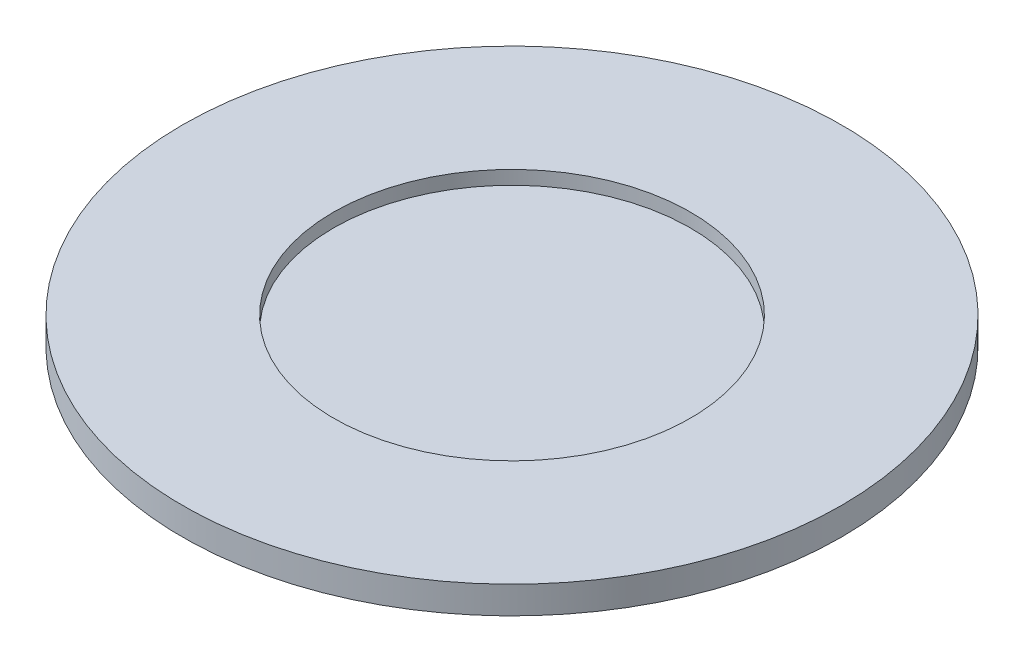
ISO-10303-21;
HEADER;
FILE_DESCRIPTION(('STEP AP214'),'2;1');
FILE_NAME('part.step','',(''),(''),'','','');
FILE_SCHEMA(('AUTOMOTIVE_DESIGN { 1 0 10303 214 1 1 1 1 }'));
ENDSEC;
DATA;
#1=APPLICATION_CONTEXT('core data for automotive mechanical design processes');
#2=APPLICATION_PROTOCOL_DEFINITION('international standard','automotive_design',2000,#1);
#3=PRODUCT_CONTEXT('',#1,'mechanical');
#4=PRODUCT('Part','Part','',(#3));
#5=PRODUCT_RELATED_PRODUCT_CATEGORY('part','',(#4));
#6=PRODUCT_DEFINITION_FORMATION('','',#4);
#7=PRODUCT_DEFINITION_CONTEXT('part definition',#1,'design');
#8=PRODUCT_DEFINITION('design','',#6,#7);
#9=PRODUCT_DEFINITION_SHAPE('','',#8);
#10=(LENGTH_UNIT() NAMED_UNIT(*) SI_UNIT(.MILLI.,.METRE.));
#11=(NAMED_UNIT(*) PLANE_ANGLE_UNIT() SI_UNIT($,.RADIAN.));
#12=(NAMED_UNIT(*) SI_UNIT($,.STERADIAN.) SOLID_ANGLE_UNIT());
#13=UNCERTAINTY_MEASURE_WITH_UNIT(LENGTH_MEASURE(1.E-05),#10,'distance_accuracy_value','');
#14=(GEOMETRIC_REPRESENTATION_CONTEXT(3) GLOBAL_UNCERTAINTY_ASSIGNED_CONTEXT((#13)) GLOBAL_UNIT_ASSIGNED_CONTEXT((#10,
#11,#12)) REPRESENTATION_CONTEXT('',''));
#15=CARTESIAN_POINT('',(0.,0.,0.));
#16=DIRECTION('',(0.,0.,1.));
#17=DIRECTION('',(1.,0.,0.));
#18=AXIS2_PLACEMENT_3D('',#15,#16,#17);
#19=CARTESIAN_POINT('',(-60.,97.7316257619381,0.));
#20=DIRECTION('',(0.,1.,0.));
#21=DIRECTION('',(-1.,0.,0.));
#22=AXIS2_PLACEMENT_3D('',#19,#20,#21);
#23=CYLINDRICAL_SURFACE('',#22,120.);
#24=CARTESIAN_POINT('',(-60.,76.3410550458716,0.));
#25=DIRECTION('',(0.,1.,0.));
#26=DIRECTION('',(-1.,0.,0.));
#27=AXIS2_PLACEMENT_3D('',#24,#25,#26);
#28=CIRCLE('',#27,120.);
#29=CARTESIAN_POINT('',(-180.,76.3410550458716,0.));
#30=VERTEX_POINT('',#29);
#31=EDGE_CURVE('E10',#30,#30,#28,.T.);
#32=ORIENTED_EDGE('',*,*,#31,.F.);
#33=EDGE_LOOP('',(#32));
#34=FACE_BOUND('',#33,.T.);
#35=CARTESIAN_POINT('',(-60.,66.3410550458716,0.));
#36=DIRECTION('',(0.,1.,0.));
#37=DIRECTION('',(-1.,0.,0.));
#38=AXIS2_PLACEMENT_3D('',#35,#36,#37);
#39=CIRCLE('',#38,120.);
#40=CARTESIAN_POINT('',(-180.,66.3410550458716,0.));
#41=VERTEX_POINT('',#40);
#42=EDGE_CURVE('E64',#41,#41,#39,.T.);
#43=ORIENTED_EDGE('',*,*,#42,.T.);
#44=EDGE_LOOP('',(#43));
#45=FACE_BOUND('',#44,.T.);
#46=ADVANCED_FACE('F39',(#34,#45),#23,.T.);
#47=CARTESIAN_POINT('',(5.00000000000001,76.3410550458716,0.));
#48=DIRECTION('',(0.,-1.,0.));
#49=DIRECTION('',(1.,0.,0.));
#50=AXIS2_PLACEMENT_3D('',#47,#48,#49);
#51=PLANE('',#50);
#52=CARTESIAN_POINT('',(-60.,76.3410550458716,0.));
#53=DIRECTION('',(0.,1.,0.));
#54=DIRECTION('',(-1.,0.,0.));
#55=AXIS2_PLACEMENT_3D('',#52,#53,#54);
#56=CIRCLE('',#55,65.);
#57=CARTESIAN_POINT('',(-125.,76.3410550458716,0.));
#58=VERTEX_POINT('',#57);
#59=EDGE_CURVE('E45',#58,#58,#56,.T.);
#60=ORIENTED_EDGE('',*,*,#59,.F.);
#61=EDGE_LOOP('',(#60));
#62=FACE_BOUND('',#61,.T.);
#63=ORIENTED_EDGE('',*,*,#31,.T.);
#64=EDGE_LOOP('',(#63));
#65=FACE_BOUND('',#64,.T.);
#66=ADVANCED_FACE('F98',(#62,#65),#51,.F.);
#67=CARTESIAN_POINT('',(-60.,97.7316257619381,0.));
#68=DIRECTION('',(0.,1.,0.));
#69=DIRECTION('',(-1.,0.,0.));
#70=AXIS2_PLACEMENT_3D('',#67,#68,#69);
#71=CYLINDRICAL_SURFACE('',#70,65.);
#72=CARTESIAN_POINT('',(-60.,71.3410550458716,0.));
#73=DIRECTION('',(0.,1.,0.));
#74=DIRECTION('',(-1.,0.,0.));
#75=AXIS2_PLACEMENT_3D('',#72,#73,#74);
#76=CIRCLE('',#75,65.);
#77=CARTESIAN_POINT('',(-125.,71.3410550458716,0.));
#78=VERTEX_POINT('',#77);
#79=EDGE_CURVE('E49',#78,#78,#76,.T.);
#80=ORIENTED_EDGE('',*,*,#79,.F.);
#81=EDGE_LOOP('',(#80));
#82=FACE_BOUND('',#81,.T.);
#83=ORIENTED_EDGE('',*,*,#59,.T.);
#84=EDGE_LOOP('',(#83));
#85=FACE_BOUND('',#84,.T.);
#86=ADVANCED_FACE('F94',(#82,#85),#71,.F.);
#87=CARTESIAN_POINT('',(5.00000000000001,71.3410550458716,0.));
#88=DIRECTION('',(0.,-1.,0.));
#89=DIRECTION('',(1.,0.,0.));
#90=AXIS2_PLACEMENT_3D('',#87,#88,#89);
#91=PLANE('',#90);
#92=ORIENTED_EDGE('',*,*,#79,.T.);
#93=EDGE_LOOP('',(#92));
#94=FACE_BOUND('',#93,.T.);
#95=ADVANCED_FACE('F89',(#94),#91,.F.);
#96=CARTESIAN_POINT('',(10.,56.3410550458716,0.));
#97=DIRECTION('',(0.,1.,0.));
#98=DIRECTION('',(-1.,0.,0.));
#99=AXIS2_PLACEMENT_3D('',#96,#97,#98);
#100=PLANE('',#99);
#101=CARTESIAN_POINT('',(-60.,56.3410550458716,0.));
#102=DIRECTION('',(0.,1.,0.));
#103=DIRECTION('',(-1.,0.,0.));
#104=AXIS2_PLACEMENT_3D('',#101,#102,#103);
#105=CIRCLE('',#104,70.);
#106=CARTESIAN_POINT('',(-130.,56.3410550458715,0.));
#107=VERTEX_POINT('',#106);
#108=EDGE_CURVE('E53',#107,#107,#105,.T.);
#109=ORIENTED_EDGE('',*,*,#108,.F.);
#110=EDGE_LOOP('',(#109));
#111=FACE_BOUND('',#110,.T.);
#112=ADVANCED_FACE('F84',(#111),#100,.F.);
#113=CARTESIAN_POINT('',(-60.,97.7316257619381,0.));
#114=DIRECTION('',(0.,1.,0.));
#115=DIRECTION('',(-1.,0.,0.));
#116=AXIS2_PLACEMENT_3D('',#113,#114,#115);
#117=CYLINDRICAL_SURFACE('',#116,70.);
#118=CARTESIAN_POINT('',(-60.,61.3410550458716,0.));
#119=DIRECTION('',(0.,1.,0.));
#120=DIRECTION('',(-1.,0.,0.));
#121=AXIS2_PLACEMENT_3D('',#118,#119,#120);
#122=CIRCLE('',#121,70.);
#123=CARTESIAN_POINT('',(-130.,61.3410550458716,0.));
#124=VERTEX_POINT('',#123);
#125=EDGE_CURVE('E58',#124,#124,#122,.T.);
#126=ORIENTED_EDGE('',*,*,#125,.F.);
#127=EDGE_LOOP('',(#126));
#128=FACE_BOUND('',#127,.T.);
#129=ORIENTED_EDGE('',*,*,#108,.T.);
#130=EDGE_LOOP('',(#129));
#131=FACE_BOUND('',#130,.T.);
#132=ADVANCED_FACE('F78',(#128,#131),#117,.T.);
#133=CARTESIAN_POINT('',(-60.,61.3410550458716,0.));
#134=DIRECTION('',(0.,1.,0.));
#135=DIRECTION('',(-1.,0.,0.));
#136=AXIS2_PLACEMENT_3D('',#133,#134,#135);
#137=TOROIDAL_SURFACE('',#136,75.,5.);
#138=CARTESIAN_POINT('',(-60.,66.3410550458716,0.));
#139=DIRECTION('',(0.,1.,0.));
#140=DIRECTION('',(-1.,0.,0.));
#141=AXIS2_PLACEMENT_3D('',#138,#139,#140);
#142=CIRCLE('',#141,75.);
#143=CARTESIAN_POINT('',(-135.,66.3410550458716,0.));
#144=VERTEX_POINT('',#143);
#145=EDGE_CURVE('E61',#144,#144,#142,.T.);
#146=ORIENTED_EDGE('',*,*,#145,.F.);
#147=EDGE_LOOP('',(#146));
#148=FACE_BOUND('',#147,.T.);
#149=ORIENTED_EDGE('',*,*,#125,.T.);
#150=EDGE_LOOP('',(#149));
#151=FACE_BOUND('',#150,.T.);
#152=ADVANCED_FACE('F72',(#148,#151),#137,.F.);
#153=CARTESIAN_POINT('',(60.,66.3410550458716,0.));
#154=DIRECTION('',(0.,1.,0.));
#155=DIRECTION('',(-1.,0.,0.));
#156=AXIS2_PLACEMENT_3D('',#153,#154,#155);
#157=PLANE('',#156);
#158=ORIENTED_EDGE('',*,*,#42,.F.);
#159=EDGE_LOOP('',(#158));
#160=FACE_BOUND('',#159,.T.);
#161=ORIENTED_EDGE('',*,*,#145,.T.);
#162=EDGE_LOOP('',(#161));
#163=FACE_BOUND('',#162,.T.);
#164=ADVANCED_FACE('F69',(#160,#163),#157,.F.);
#165=CLOSED_SHELL('',(#46,#66,#86,#95,#112,#132,#152,#164));
#166=MANIFOLD_SOLID_BREP('B2',#165);
#167=ADVANCED_BREP_SHAPE_REPRESENTATION('',(#18,#166),#14);
#168=SHAPE_DEFINITION_REPRESENTATION(#9,#167);
ENDSEC;
END-ISO-10303-21;
